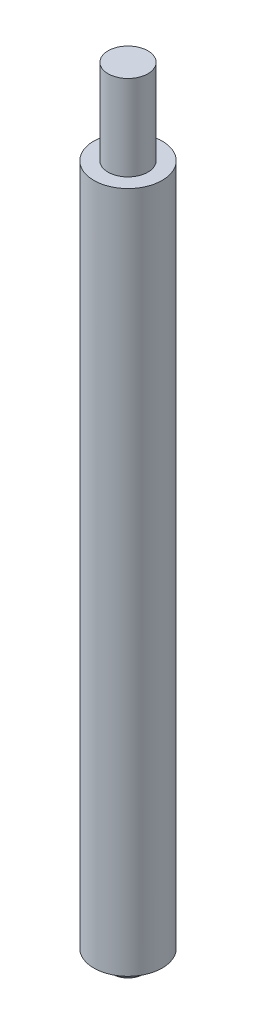
ISO-10303-21;
HEADER;
FILE_DESCRIPTION(('STEP AP214'),'2;1');
FILE_NAME('part.step','',(''),(''),'','','');
FILE_SCHEMA(('AUTOMOTIVE_DESIGN { 1 0 10303 214 1 1 1 1 }'));
ENDSEC;
DATA;
#1=APPLICATION_CONTEXT('core data for automotive mechanical design processes');
#2=APPLICATION_PROTOCOL_DEFINITION('international standard','automotive_design',2000,#1);
#3=PRODUCT_CONTEXT('',#1,'mechanical');
#4=PRODUCT('Part','Part','',(#3));
#5=PRODUCT_RELATED_PRODUCT_CATEGORY('part','',(#4));
#6=PRODUCT_DEFINITION_FORMATION('','',#4);
#7=PRODUCT_DEFINITION_CONTEXT('part definition',#1,'design');
#8=PRODUCT_DEFINITION('design','',#6,#7);
#9=PRODUCT_DEFINITION_SHAPE('','',#8);
#10=(LENGTH_UNIT() NAMED_UNIT(*) SI_UNIT(.MILLI.,.METRE.));
#11=(NAMED_UNIT(*) PLANE_ANGLE_UNIT() SI_UNIT($,.RADIAN.));
#12=(NAMED_UNIT(*) SI_UNIT($,.STERADIAN.) SOLID_ANGLE_UNIT());
#13=UNCERTAINTY_MEASURE_WITH_UNIT(LENGTH_MEASURE(1.E-05),#10,'distance_accuracy_value','');
#14=(GEOMETRIC_REPRESENTATION_CONTEXT(3) GLOBAL_UNCERTAINTY_ASSIGNED_CONTEXT((#13)) GLOBAL_UNIT_ASSIGNED_CONTEXT((#10,
#11,#12)) REPRESENTATION_CONTEXT('',''));
#15=CARTESIAN_POINT('',(0.,0.,0.));
#16=DIRECTION('',(0.,0.,1.));
#17=DIRECTION('',(1.,0.,0.));
#18=AXIS2_PLACEMENT_3D('',#15,#16,#17);
#19=CARTESIAN_POINT('',(-96.7001456463524,-22.870352222622,67.1505988003095));
#20=DIRECTION('',(0.,1.,0.));
#21=DIRECTION('',(1.,0.,0.));
#22=AXIS2_PLACEMENT_3D('',#19,#20,#21);
#23=PLANE('',#22);
#24=CARTESIAN_POINT('',(-95.3818314870717,-22.8703522226219,71.4829226878837));
#25=CARTESIAN_POINT('',(-95.3960576772888,-22.8703522226219,71.4432449011433));
#26=CARTESIAN_POINT('',(-95.4144244871922,-22.870352222622,71.4051692968318));
#27=CARTESIAN_POINT('',(-95.4366310258396,-22.870352222622,71.3693285360263));
#28=CARTESIAN_POINT('',(-95.4599434320704,-22.870352222622,71.3317029344507));
#29=CARTESIAN_POINT('',(-95.4873451779063,-22.870352222622,71.2967700448145));
#30=CARTESIAN_POINT('',(-95.5183365804766,-22.870352222622,71.265168082451));
#31=CARTESIAN_POINT('',(-95.573051930705,-22.870352222622,71.2093747883365));
#32=CARTESIAN_POINT('',(-95.6381386493742,-22.8703522226219,71.1647976678059));
#33=CARTESIAN_POINT('',(-95.7099372139978,-22.8703522226219,71.1339503615537));
#34=CARTESIAN_POINT('',(-95.7817080276649,-22.8703522226219,71.103114978134));
#35=CARTESIAN_POINT('',(-95.8588131257353,-22.870352222622,71.0865885419351));
#36=CARTESIAN_POINT('',(-95.9369166414225,-22.870352222622,71.0853059780164));
#37=CARTESIAN_POINT('',(-96.0150073758141,-22.870352222622,71.0840236239836));
#38=CARTESIAN_POINT('',(-96.0926004455744,-22.8703522226221,71.098004820448));
#39=CARTESIAN_POINT('',(-96.1653314885424,-22.8703522226221,71.1264649397174));
#40=CARTESIAN_POINT('',(-96.2380731721887,-22.8703522226221,71.1549292227519));
#41=CARTESIAN_POINT('',(-96.3045571200846,-22.870352222622,71.1973310562121));
#42=CARTESIAN_POINT('',(-96.3610445718864,-22.870352222622,71.2512825753499));
#43=CARTESIAN_POINT('',(-96.4175524876116,-22.870352222622,71.3052536397092));
#44=CARTESIAN_POINT('',(-96.4629741334169,-22.870352222622,71.3697486769833));
#45=CARTESIAN_POINT('',(-96.4947575336272,-22.870352222622,71.4411342664776));
#46=CARTESIAN_POINT('',(-96.5265526718451,-22.870352222622,71.5125462195642));
#47=CARTESIAN_POINT('',(-96.5440913165538,-22.8703522226221,71.5894876016694));
#48=CARTESIAN_POINT('',(-96.5463909276661,-22.8703522226221,71.6676244877882));
#49=CARTESIAN_POINT('',(-96.5485982124589,-22.8703522226221,71.7426242821283));
#50=CARTESIAN_POINT('',(-96.5367251328207,-22.870352222622,71.8173508398698));
#51=CARTESIAN_POINT('',(-96.5114199865123,-22.870352222622,71.8879286378893));
#52=B_SPLINE_CURVE_WITH_KNOTS('',3,(#24,#25,#26,#27,#28,#29,#30,#31,#32,#33,#34,#35,#36,#37,#38,
#39,#40,#41,#42,#43,#44,#45,#46,#47,#48,#49,#50,#51),.UNSPECIFIED.,.F.,.F.,(4,3,3,3,3,3,3,3,3,
4),(0.000630334398229015,0.0132791373473702,0.0265578404071297,0.0500014030805623,
0.0734359045520951,0.0968665710709033,0.120300665537046,0.143743249561521,0.167194491225868,
0.189704196810673),.UNSPECIFIED.);
#53=CARTESIAN_POINT('',(-95.3818314870244,-22.870352222622,71.4829226878667));
#54=VERTEX_POINT('',#53);
#55=CARTESIAN_POINT('',(-96.5114199874031,-22.870352222622,71.8879286382087));
#56=VERTEX_POINT('',#55);
#57=EDGE_CURVE('P0_E11',#54,#56,#52,.T.);
#58=ORIENTED_EDGE('',*,*,#57,.T.);
#59=CARTESIAN_POINT('',(-96.5114199865123,-22.870352222622,71.8879286378893));
#60=CARTESIAN_POINT('',(-96.5103569598975,-22.870352222622,71.8908934924212));
#61=CARTESIAN_POINT('',(-96.5092702297318,-22.870352222622,71.8938510256421));
#62=CARTESIAN_POINT('',(-96.5081598440748,-22.870352222622,71.8968009502516));
#63=CARTESIAN_POINT('',(-96.48062009427,-22.870352222622,71.9699648867467));
#64=CARTESIAN_POINT('',(-96.4390544717467,-22.870352222622,72.0370523752684));
#65=CARTESIAN_POINT('',(-96.3858016098254,-22.870352222622,72.0942843729287));
#66=CARTESIAN_POINT('',(-96.3325668151599,-22.870352222622,72.15149695332));
#67=CARTESIAN_POINT('',(-96.2686689304736,-22.870352222622,72.1977685064685));
#68=CARTESIAN_POINT('',(-96.1977011173596,-22.870352222622,72.2304904316466));
#69=CARTESIAN_POINT('',(-96.1267602060486,-22.870352222622,72.2631999529088));
#70=CARTESIAN_POINT('',(-96.0501108606549,-22.8703522226219,72.2817447105995));
#71=CARTESIAN_POINT('',(-95.9720636985151,-22.8703522226219,72.2850761822893));
#72=CARTESIAN_POINT('',(-95.8940325637017,-22.8703522226219,72.2884069698469));
#73=CARTESIAN_POINT('',(-95.816098254741,-22.870352222622,72.2764668377156));
#74=CARTESIAN_POINT('',(-95.742644527048,-22.870352222622,72.2499249318624));
#75=CARTESIAN_POINT('',(-95.669183891389,-22.870352222622,72.223380529872));
#76=CARTESIAN_POINT('',(-95.6016126290052,-22.8703522226221,72.1827403570447));
#77=CARTESIAN_POINT('',(-95.5437308219464,-22.8703522226221,72.1302923623146));
#78=CARTESIAN_POINT('',(-95.4858287521226,-22.8703522226221,72.0778260070418));
#79=CARTESIAN_POINT('',(-95.4387324812088,-22.8703522226219,72.0145491022437));
#80=CARTESIAN_POINT('',(-95.4050880748095,-22.8703522226219,71.9440261458618));
#81=CARTESIAN_POINT('',(-95.3851421804425,-22.8703522226219,71.9022170135577));
#82=CARTESIAN_POINT('',(-95.3701499983947,-22.870352222622,71.858335405882));
#83=CARTESIAN_POINT('',(-95.3603401898031,-22.870352222622,71.813277408795));
#84=B_SPLINE_CURVE_WITH_KNOTS('',3,(#59,#60,#61,#62,#63,#64,#65,#66,#67,#68,#69,#70,#71,#72,#73,
#74,#75,#76,#77,#78,#79,#80,#81,#82,#83),.UNSPECIFIED.,.F.,.F.,(4,3,3,3,3,3,3,3,4),
(0.189704196810673,0.190649791664673,0.214102405207511,0.23754706191284,0.26098283144087,
0.284413788331012,0.307846948788762,0.331288312525664,0.345185391266356),.UNSPECIFIED.);
#85=CARTESIAN_POINT('',(-95.3603401898032,-22.8703522226219,71.813277408795));
#86=VERTEX_POINT('',#85);
#87=EDGE_CURVE('P0_E31',#56,#86,#84,.T.);
#88=ORIENTED_EDGE('',*,*,#87,.T.);
#89=CARTESIAN_POINT('',(-95.3603401898031,-22.870352222622,71.813277408795));
#90=CARTESIAN_POINT('',(-95.3535962703531,-22.870352222622,71.782301523782));
#91=CARTESIAN_POINT('',(-95.3493014874417,-22.8703522226221,71.7507696881847));
#92=CARTESIAN_POINT('',(-95.3475296602852,-22.8703522226221,71.7189731473775));
#93=CARTESIAN_POINT('',(-95.3431795639578,-22.8703522226221,71.6409079620214));
#94=CARTESIAN_POINT('',(-95.3541211655022,-22.8703522226219,71.5627380970526));
#95=CARTESIAN_POINT('',(-95.3797355490204,-22.8703522226219,71.4888663976295));
#96=CARTESIAN_POINT('',(-95.3804238874811,-22.8703522226219,71.4868812344168));
#97=CARTESIAN_POINT('',(-95.3811225459106,-22.8703522226219,71.4848999717364));
#98=CARTESIAN_POINT('',(-95.3818314870717,-22.8703522226219,71.4829226878837));
#99=B_SPLINE_CURVE_WITH_KNOTS('',3,(#89,#90,#91,#92,#93,#94,#95,#96,#97,#98),.UNSPECIFIED.,.F.,
.F.,(4,3,3,4),(-0.0330097247126543,-0.0234559420122086,0.,0.000630334398229015),.UNSPECIFIED.);
#100=EDGE_CURVE('P0_E52',#86,#54,#99,.T.);
#101=ORIENTED_EDGE('',*,*,#100,.T.);
#102=EDGE_LOOP('',(#58,#88,#101));
#103=FACE_BOUND('',#102,.T.);
#104=ADVANCED_FACE('P0_F17',(#103),#23,.T.);
#105=CARTESIAN_POINT('',(-95.3603401898031,-22.870352222622,71.813277408795));
#106=CARTESIAN_POINT('',(-95.3603401898031,-34.870352222622,71.813277408795));
#107=CARTESIAN_POINT('',(-95.3701499983947,-22.870352222622,71.858335405882));
#108=CARTESIAN_POINT('',(-95.3701499983947,-34.870352222622,71.858335405882));
#109=CARTESIAN_POINT('',(-95.3851421804425,-22.8703522226219,71.9022170135577));
#110=CARTESIAN_POINT('',(-95.3851421804425,-34.8703522226219,71.9022170135577));
#111=CARTESIAN_POINT('',(-95.4387324812088,-22.8703522226219,72.0145491022437));
#112=CARTESIAN_POINT('',(-95.4387324812088,-34.8703522226219,72.0145491022437));
#113=CARTESIAN_POINT('',(-95.4858287521226,-22.8703522226221,72.0778260070418));
#114=CARTESIAN_POINT('',(-95.4858287521226,-34.8703522226221,72.0778260070418));
#115=CARTESIAN_POINT('',(-95.6016126290052,-22.8703522226221,72.1827403570447));
#116=CARTESIAN_POINT('',(-95.6016126290052,-34.8703522226221,72.1827403570447));
#117=CARTESIAN_POINT('',(-95.669183891389,-22.870352222622,72.223380529872));
#118=CARTESIAN_POINT('',(-95.669183891389,-34.870352222622,72.223380529872));
#119=CARTESIAN_POINT('',(-95.816098254741,-22.870352222622,72.2764668377156));
#120=CARTESIAN_POINT('',(-95.816098254741,-34.870352222622,72.2764668377156));
#121=CARTESIAN_POINT('',(-95.8940325637017,-22.8703522226219,72.2884069698469));
#122=CARTESIAN_POINT('',(-95.8940325637017,-34.8703522226219,72.2884069698469));
#123=CARTESIAN_POINT('',(-96.0501108606549,-22.8703522226219,72.2817447105995));
#124=CARTESIAN_POINT('',(-96.0501108606549,-34.8703522226219,72.2817447105995));
#125=CARTESIAN_POINT('',(-96.1267602060486,-22.870352222622,72.2631999529088));
#126=CARTESIAN_POINT('',(-96.1267602060486,-34.870352222622,72.2631999529088));
#127=CARTESIAN_POINT('',(-96.2686689304736,-22.870352222622,72.1977685064685));
#128=CARTESIAN_POINT('',(-96.2686689304736,-34.870352222622,72.1977685064685));
#129=CARTESIAN_POINT('',(-96.3325668151599,-22.870352222622,72.15149695332));
#130=CARTESIAN_POINT('',(-96.3325668151599,-34.870352222622,72.15149695332));
#131=CARTESIAN_POINT('',(-96.4390544717467,-22.870352222622,72.0370523752684));
#132=CARTESIAN_POINT('',(-96.4390544717467,-34.870352222622,72.0370523752684));
#133=CARTESIAN_POINT('',(-96.48062009427,-22.870352222622,71.9699648867467));
#134=CARTESIAN_POINT('',(-96.48062009427,-34.870352222622,71.9699648867467));
#135=CARTESIAN_POINT('',(-96.5357027490266,-22.870352222622,71.8236286315827));
#136=CARTESIAN_POINT('',(-96.5357027490266,-34.870352222622,71.8236286315827));
#137=CARTESIAN_POINT('',(-96.5486909367788,-22.8703522226221,71.7457748972846));
#138=CARTESIAN_POINT('',(-96.5486909367788,-34.8703522226221,71.7457748972846));
#139=CARTESIAN_POINT('',(-96.5440913165538,-22.8703522226221,71.5894876016694));
#140=CARTESIAN_POINT('',(-96.5440913165538,-34.8703522226221,71.5894876016694));
#141=CARTESIAN_POINT('',(-96.5265526718451,-22.870352222622,71.5125462195642));
#142=CARTESIAN_POINT('',(-96.5265526718451,-34.870352222622,71.5125462195642));
#143=CARTESIAN_POINT('',(-96.4629741334169,-22.870352222622,71.3697486769833));
#144=CARTESIAN_POINT('',(-96.4629741334169,-34.870352222622,71.3697486769833));
#145=CARTESIAN_POINT('',(-96.4175524876116,-22.870352222622,71.3052536397092));
#146=CARTESIAN_POINT('',(-96.4175524876116,-34.870352222622,71.3052536397092));
#147=CARTESIAN_POINT('',(-96.3045571200846,-22.870352222622,71.1973310562121));
#148=CARTESIAN_POINT('',(-96.3045571200846,-34.870352222622,71.1973310562121));
#149=CARTESIAN_POINT('',(-96.2380731721887,-22.8703522226221,71.1549292227519));
#150=CARTESIAN_POINT('',(-96.2380731721887,-34.8703522226221,71.1549292227519));
#151=CARTESIAN_POINT('',(-96.0926004455744,-22.8703522226221,71.098004820448));
#152=CARTESIAN_POINT('',(-96.0926004455744,-34.8703522226221,71.098004820448));
#153=CARTESIAN_POINT('',(-96.0150073758141,-22.870352222622,71.0840236239836));
#154=CARTESIAN_POINT('',(-96.0150073758141,-34.870352222622,71.0840236239836));
#155=CARTESIAN_POINT('',(-95.8588131257353,-22.870352222622,71.0865885419351));
#156=CARTESIAN_POINT('',(-95.8588131257353,-34.870352222622,71.0865885419351));
#157=CARTESIAN_POINT('',(-95.7817080276649,-22.8703522226219,71.103114978134));
#158=CARTESIAN_POINT('',(-95.7817080276649,-34.8703522226219,71.103114978134));
#159=CARTESIAN_POINT('',(-95.6381386493742,-22.8703522226219,71.1647976678059));
#160=CARTESIAN_POINT('',(-95.6381386493742,-34.8703522226219,71.1647976678059));
#161=CARTESIAN_POINT('',(-95.573051930705,-22.870352222622,71.2093747883365));
#162=CARTESIAN_POINT('',(-95.573051930705,-34.870352222622,71.2093747883365));
#163=CARTESIAN_POINT('',(-95.4873451779063,-22.870352222622,71.2967700448145));
#164=CARTESIAN_POINT('',(-95.4873451779063,-34.870352222622,71.2967700448145));
#165=CARTESIAN_POINT('',(-95.4599434320704,-22.870352222622,71.3317029344507));
#166=CARTESIAN_POINT('',(-95.4599434320704,-34.870352222622,71.3317029344507));
#167=CARTESIAN_POINT('',(-95.4133178571632,-22.870352222622,71.4069553681688));
#168=CARTESIAN_POINT('',(-95.4133178571632,-34.870352222622,71.4069553681688));
#169=CARTESIAN_POINT('',(-95.3942366471484,-22.8703522226219,71.4470453340281));
#170=CARTESIAN_POINT('',(-95.3942366471484,-34.8703522226219,71.4470453340281));
#171=CARTESIAN_POINT('',(-95.3797355490204,-22.8703522226219,71.4888663976295));
#172=CARTESIAN_POINT('',(-95.3797355490204,-34.8703522226219,71.4888663976295));
#173=CARTESIAN_POINT('',(-95.3541211655022,-22.8703522226219,71.5627380970526));
#174=CARTESIAN_POINT('',(-95.3541211655022,-34.8703522226219,71.5627380970526));
#175=CARTESIAN_POINT('',(-95.3431795639578,-22.8703522226221,71.6409079620214));
#176=CARTESIAN_POINT('',(-95.3431795639578,-34.8703522226221,71.6409079620214));
#177=CARTESIAN_POINT('',(-95.3493014874417,-22.8703522226221,71.7507696881847));
#178=CARTESIAN_POINT('',(-95.3493014874417,-34.8703522226221,71.7507696881847));
#179=CARTESIAN_POINT('',(-95.3535962703531,-22.870352222622,71.782301523782));
#180=CARTESIAN_POINT('',(-95.3535962703531,-34.870352222622,71.782301523782));
#181=CARTESIAN_POINT('',(-95.3603401898031,-22.870352222622,71.813277408795));
#182=CARTESIAN_POINT('',(-95.3603401898031,-34.870352222622,71.813277408795));
#183=B_SPLINE_SURFACE_WITH_KNOTS('',3,1,((#105,#106),(#107,#108),(#109,#110),(#111,#112),(#113,
#114),(#115,#116),(#117,#118),(#119,#120),(#121,#122),(#123,#124),(#125,#126),(#127,#128),(#129,
#130),(#131,#132),(#133,#134),(#135,#136),(#137,#138),(#139,#140),(#141,#142),(#143,#144),(#145,
#146),(#147,#148),(#149,#150),(#151,#152),(#153,#154),(#155,#156),(#157,#158),(#159,#160),(#161,
#162),(#163,#164),(#165,#166),(#167,#168),(#169,#170),(#171,#172),(#173,#174),(#175,#176),(#177,
#178),(#179,#180),(#181,#182)),.UNSPECIFIED.,.T.,.F.,.F.,(4,2,2,2,2,2,2,2,2,2,2,2,2,2,2,2,3,2,
4),(2,2),(-0.345185391266356,-0.331288312525664,-0.307846948788762,-0.284413788331012,
-0.26098283144087,-0.23754706191284,-0.214102405207511,-0.190649791664673,-0.167194491225868,
-0.143743249561521,-0.120300665537046,-0.0968665710709033,-0.0734359045520951,
-0.0500014030805623,-0.0265578404071297,-0.0132791373473702,0.,0.0234559420122086,
0.0330097247126543),(0.,1.2),.UNSPECIFIED.);
#184=CARTESIAN_POINT('',(-95.3603401898031,-34.870352222622,71.813277408795));
#185=CARTESIAN_POINT('',(-95.3701499983947,-34.870352222622,71.858335405882));
#186=CARTESIAN_POINT('',(-95.3851421804425,-34.8703522226219,71.9022170135577));
#187=CARTESIAN_POINT('',(-95.4050880748095,-34.8703522226219,71.9440261458618));
#188=CARTESIAN_POINT('',(-95.4387324812088,-34.8703522226219,72.0145491022437));
#189=CARTESIAN_POINT('',(-95.4858287521226,-34.8703522226221,72.0778260070418));
#190=CARTESIAN_POINT('',(-95.5437308219464,-34.8703522226221,72.1302923623146));
#191=CARTESIAN_POINT('',(-95.6016126290052,-34.8703522226221,72.1827403570447));
#192=CARTESIAN_POINT('',(-95.669183891389,-34.870352222622,72.223380529872));
#193=CARTESIAN_POINT('',(-95.742644527048,-34.870352222622,72.2499249318624));
#194=CARTESIAN_POINT('',(-95.816098254741,-34.870352222622,72.2764668377156));
#195=CARTESIAN_POINT('',(-95.8940325637017,-34.8703522226219,72.2884069698469));
#196=CARTESIAN_POINT('',(-95.9720636985151,-34.8703522226219,72.2850761822893));
#197=CARTESIAN_POINT('',(-96.0501108606549,-34.8703522226219,72.2817447105995));
#198=CARTESIAN_POINT('',(-96.1267602060486,-34.870352222622,72.2631999529088));
#199=CARTESIAN_POINT('',(-96.1977011173596,-34.870352222622,72.2304904316466));
#200=CARTESIAN_POINT('',(-96.2686689304736,-34.870352222622,72.1977685064685));
#201=CARTESIAN_POINT('',(-96.3325668151599,-34.870352222622,72.15149695332));
#202=CARTESIAN_POINT('',(-96.3858016098254,-34.870352222622,72.0942843729287));
#203=CARTESIAN_POINT('',(-96.4390544717467,-34.870352222622,72.0370523752684));
#204=CARTESIAN_POINT('',(-96.48062009427,-34.870352222622,71.9699648867467));
#205=CARTESIAN_POINT('',(-96.5081598440748,-34.870352222622,71.8968009502516));
#206=CARTESIAN_POINT('',(-96.5357027490266,-34.870352222622,71.8236286315827));
#207=CARTESIAN_POINT('',(-96.5486909367788,-34.8703522226221,71.7457748972846));
#208=CARTESIAN_POINT('',(-96.5463909276661,-34.8703522226221,71.6676244877882));
#209=CARTESIAN_POINT('',(-96.5440913165538,-34.8703522226221,71.5894876016694));
#210=CARTESIAN_POINT('',(-96.5265526718451,-34.870352222622,71.5125462195642));
#211=CARTESIAN_POINT('',(-96.4947575336272,-34.870352222622,71.4411342664776));
#212=CARTESIAN_POINT('',(-96.4629741334169,-34.870352222622,71.3697486769833));
#213=CARTESIAN_POINT('',(-96.4175524876116,-34.870352222622,71.3052536397092));
#214=CARTESIAN_POINT('',(-96.3610445718864,-34.870352222622,71.2512825753499));
#215=CARTESIAN_POINT('',(-96.3045571200846,-34.870352222622,71.1973310562121));
#216=CARTESIAN_POINT('',(-96.2380731721887,-34.8703522226221,71.1549292227519));
#217=CARTESIAN_POINT('',(-96.1653314885424,-34.8703522226221,71.1264649397174));
#218=CARTESIAN_POINT('',(-96.0926004455744,-34.8703522226221,71.098004820448));
#219=CARTESIAN_POINT('',(-96.0150073758141,-34.870352222622,71.0840236239836));
#220=CARTESIAN_POINT('',(-95.9369166414225,-34.870352222622,71.0853059780164));
#221=CARTESIAN_POINT('',(-95.8588131257353,-34.870352222622,71.0865885419351));
#222=CARTESIAN_POINT('',(-95.7817080276649,-34.8703522226219,71.103114978134));
#223=CARTESIAN_POINT('',(-95.7099372139978,-34.8703522226219,71.1339503615537));
#224=CARTESIAN_POINT('',(-95.6381386493742,-34.8703522226219,71.1647976678059));
#225=CARTESIAN_POINT('',(-95.573051930705,-34.870352222622,71.2093747883365));
#226=CARTESIAN_POINT('',(-95.5183365804766,-34.870352222622,71.265168082451));
#227=CARTESIAN_POINT('',(-95.4873451779063,-34.870352222622,71.2967700448145));
#228=CARTESIAN_POINT('',(-95.4599434320704,-34.870352222622,71.3317029344507));
#229=CARTESIAN_POINT('',(-95.4366310258396,-34.870352222622,71.3693285360263));
#230=CARTESIAN_POINT('',(-95.4133178571632,-34.870352222622,71.4069553681688));
#231=CARTESIAN_POINT('',(-95.3942366471484,-34.8703522226219,71.4470453340281));
#232=CARTESIAN_POINT('',(-95.3797355490204,-34.8703522226219,71.4888663976295));
#233=CARTESIAN_POINT('',(-95.3541211655022,-34.8703522226219,71.5627380970526));
#234=CARTESIAN_POINT('',(-95.3431795639578,-34.8703522226221,71.6409079620214));
#235=CARTESIAN_POINT('',(-95.3475296602852,-34.8703522226221,71.7189731473775));
#236=CARTESIAN_POINT('',(-95.3493014874417,-34.8703522226221,71.7507696881847));
#237=CARTESIAN_POINT('',(-95.3535962703531,-34.870352222622,71.782301523782));
#238=CARTESIAN_POINT('',(-95.3603401898031,-34.870352222622,71.813277408795));
#239=B_SPLINE_CURVE_WITH_KNOTS('',3,(#184,#185,#186,#187,#188,#189,#190,#191,#192,#193,#194,
#195,#196,#197,#198,#199,#200,#201,#202,#203,#204,#205,#206,#207,#208,#209,#210,#211,#212,#213,
#214,#215,#216,#217,#218,#219,#220,#221,#222,#223,#224,#225,#226,#227,#228,#229,#230,#231,#232,
#233,#234,#235,#236,#237,#238),.UNSPECIFIED.,.T.,.F.,(4,3,3,3,3,3,3,3,3,3,3,3,3,3,3,3,3,3,4),
(-0.345185391266356,-0.331288312525664,-0.307846948788762,-0.284413788331012,-0.26098283144087,
-0.23754706191284,-0.214102405207511,-0.190649791664673,-0.167194491225868,-0.143743249561521,
-0.120300665537046,-0.0968665710709033,-0.0734359045520951,-0.0500014030805623,
-0.0265578404071297,-0.0132791373473702,0.,0.0234559420122086,0.0330097247126543),.UNSPECIFIED.);
#240=CARTESIAN_POINT('',(-95.3603401898031,-34.870352222622,71.813277408795));
#241=VERTEX_POINT('',#240);
#242=EDGE_CURVE('P0_E23',#241,#241,#239,.T.);
#243=ORIENTED_EDGE('',*,*,#242,.F.);
#244=EDGE_LOOP('',(#243));
#245=FACE_BOUND('',#244,.T.);
#246=ORIENTED_EDGE('',*,*,#100,.F.);
#247=ORIENTED_EDGE('',*,*,#87,.F.);
#248=ORIENTED_EDGE('',*,*,#57,.F.);
#249=EDGE_LOOP('',(#246,#247,#248));
#250=FACE_BOUND('',#249,.T.);
#251=ADVANCED_FACE('P0_F19',(#245,#250),#183,.T.);
#252=CARTESIAN_POINT('',(-96.6648605731407,-34.870352222622,67.0894080918052));
#253=DIRECTION('',(0.,1.,0.));
#254=DIRECTION('',(1.,0.,0.));
#255=AXIS2_PLACEMENT_3D('',#252,#253,#254);
#256=PLANE('',#255);
#257=ORIENTED_EDGE('',*,*,#242,.T.);
#258=EDGE_LOOP('',(#257));
#259=FACE_BOUND('',#258,.T.);
#260=ADVANCED_FACE('P0_F80',(#259),#256,.F.);
#261=CLOSED_SHELL('',(#104,#251,#260));
#262=MANIFOLD_SOLID_BREP('P0_B1',#261);
#263=CARTESIAN_POINT('',(-81.665808000505,-21.3703528404236,27.730238100206));
#264=DIRECTION('',(0.,1.,0.));
#265=DIRECTION('',(0.,0.,-1.));
#266=AXIS2_PLACEMENT_3D('',#263,#264,#265);
#267=PLANE('',#266);
#268=CARTESIAN_POINT('',(-95.9466257372137,-21.3703528404236,71.6854256630377));
#269=DIRECTION('',(0.,1.,0.));
#270=DIRECTION('',(2.1425115015461E-09,0.,1.));
#271=AXIS2_PLACEMENT_3D('',#268,#269,#270);
#272=CIRCLE('',#271,0.35);
#273=CARTESIAN_POINT('',(-95.9466257364638,-21.3703528404236,72.0354256630377));
#274=VERTEX_POINT('',#273);
#275=EDGE_CURVE('P1_E10',#274,#274,#272,.T.);
#276=ORIENTED_EDGE('',*,*,#275,.T.);
#277=EDGE_LOOP('',(#276));
#278=FACE_BOUND('',#277,.T.);
#279=ADVANCED_FACE('P1_F15',(#278),#267,.T.);
#280=CARTESIAN_POINT('',(-95.9466257372137,-22.8703528404236,71.6854256630377));
#281=DIRECTION('',(0.,1.,0.));
#282=DIRECTION('',(2.1425115015461E-09,0.,1.));
#283=AXIS2_PLACEMENT_3D('',#280,#281,#282);
#284=CYLINDRICAL_SURFACE('',#283,0.35);
#285=CARTESIAN_POINT('',(-95.9466257372137,-34.9703528404236,71.6854256630377));
#286=DIRECTION('',(0.,-1.,0.));
#287=DIRECTION('',(2.14248936052691E-09,0.,1.));
#288=AXIS2_PLACEMENT_3D('',#285,#286,#287);
#289=CIRCLE('',#288,0.35);
#290=CARTESIAN_POINT('',(-95.9466257364638,-34.9703528404236,72.0354256630377));
#291=VERTEX_POINT('',#290);
#292=EDGE_CURVE('P1_E23',#291,#291,#289,.T.);
#293=ORIENTED_EDGE('',*,*,#292,.F.);
#294=EDGE_LOOP('',(#293));
#295=FACE_BOUND('',#294,.T.);
#296=ORIENTED_EDGE('',*,*,#275,.F.);
#297=EDGE_LOOP('',(#296));
#298=FACE_BOUND('',#297,.T.);
#299=ADVANCED_FACE('P1_F49',(#295,#298),#284,.T.);
#300=CARTESIAN_POINT('',(-81.665808000505,-35.1703528404236,27.730238100206));
#301=DIRECTION('',(0.,1.,0.));
#302=DIRECTION('',(0.,0.,-1.));
#303=AXIS2_PLACEMENT_3D('',#300,#301,#302);
#304=PLANE('',#303);
#305=CARTESIAN_POINT('',(-95.9466257372137,-35.1703528404236,71.6854256630377));
#306=DIRECTION('',(0.,1.,0.));
#307=DIRECTION('',(2.14248936052691E-09,0.,1.));
#308=AXIS2_PLACEMENT_3D('',#305,#306,#307);
#309=CIRCLE('',#308,0.15);
#310=CARTESIAN_POINT('',(-95.9466257368923,-35.1703528404236,71.8354256630377));
#311=VERTEX_POINT('',#310);
#312=EDGE_CURVE('P1_E33',#311,#311,#309,.T.);
#313=ORIENTED_EDGE('',*,*,#312,.F.);
#314=EDGE_LOOP('',(#313));
#315=FACE_BOUND('',#314,.T.);
#316=ADVANCED_FACE('P1_F47',(#315),#304,.F.);
#317=CARTESIAN_POINT('',(-95.9466257372137,-34.9703528404235,71.6854256630377));
#318=DIRECTION('',(0.,-1.,0.));
#319=DIRECTION('',(0.,0.,-1.));
#320=AXIS2_PLACEMENT_3D('',#317,#318,#319);
#321=DEGENERATE_TOROIDAL_SURFACE('',#320,0.150000000000011,0.200000000000005,.T.);
#322=ORIENTED_EDGE('',*,*,#292,.T.);
#323=EDGE_LOOP('',(#322));
#324=FACE_BOUND('',#323,.T.);
#325=ORIENTED_EDGE('',*,*,#312,.T.);
#326=EDGE_LOOP('',(#325));
#327=FACE_BOUND('',#326,.T.);
#328=ADVANCED_FACE('P1_F17',(#324,#327),#321,.T.);
#329=CLOSED_SHELL('',(#279,#299,#316,#328));
#330=MANIFOLD_SOLID_BREP('P1_B1',#329);
#331=ADVANCED_BREP_SHAPE_REPRESENTATION('',(#18,#262,#330),#14);
#332=SHAPE_DEFINITION_REPRESENTATION(#9,#331);
ENDSEC;
END-ISO-10303-21;
